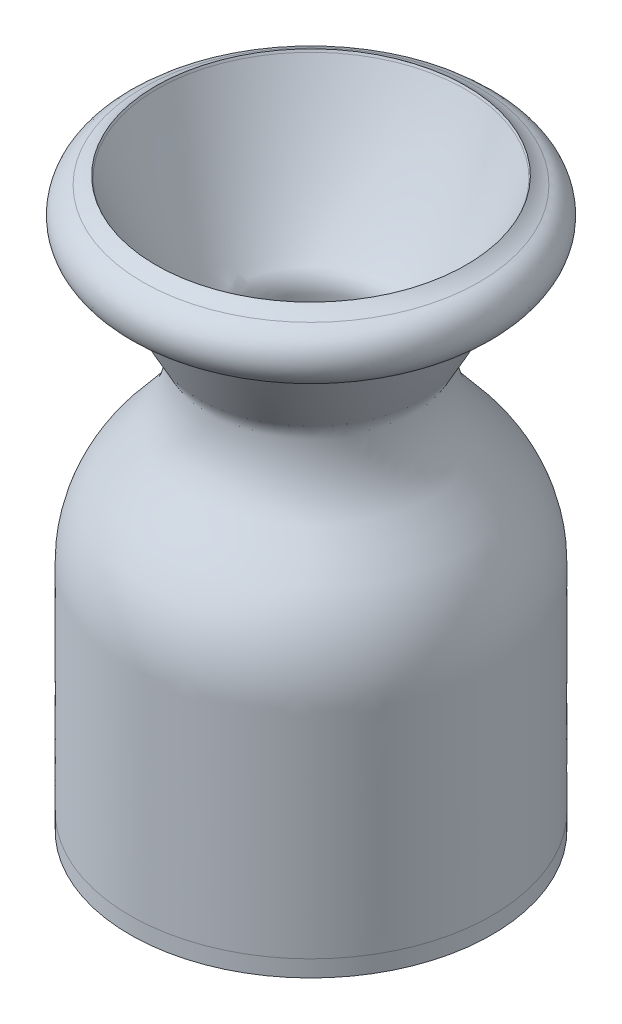
ISO-10303-21;
HEADER;
FILE_DESCRIPTION(('STEP AP214'),'2;1');
FILE_NAME('part.step','',(''),(''),'','','');
FILE_SCHEMA(('AUTOMOTIVE_DESIGN { 1 0 10303 214 1 1 1 1 }'));
ENDSEC;
DATA;
#1=APPLICATION_CONTEXT('core data for automotive mechanical design processes');
#2=APPLICATION_PROTOCOL_DEFINITION('international standard','automotive_design',2000,#1);
#3=PRODUCT_CONTEXT('',#1,'mechanical');
#4=PRODUCT('Part','Part','',(#3));
#5=PRODUCT_RELATED_PRODUCT_CATEGORY('part','',(#4));
#6=PRODUCT_DEFINITION_FORMATION('','',#4);
#7=PRODUCT_DEFINITION_CONTEXT('part definition',#1,'design');
#8=PRODUCT_DEFINITION('design','',#6,#7);
#9=PRODUCT_DEFINITION_SHAPE('','',#8);
#10=(LENGTH_UNIT() NAMED_UNIT(*) SI_UNIT(.MILLI.,.METRE.));
#11=(NAMED_UNIT(*) PLANE_ANGLE_UNIT() SI_UNIT($,.RADIAN.));
#12=(NAMED_UNIT(*) SI_UNIT($,.STERADIAN.) SOLID_ANGLE_UNIT());
#13=UNCERTAINTY_MEASURE_WITH_UNIT(LENGTH_MEASURE(1.E-05),#10,'distance_accuracy_value','');
#14=(GEOMETRIC_REPRESENTATION_CONTEXT(3) GLOBAL_UNCERTAINTY_ASSIGNED_CONTEXT((#13)) GLOBAL_UNIT_ASSIGNED_CONTEXT((#10,
#11,#12)) REPRESENTATION_CONTEXT('',''));
#15=CARTESIAN_POINT('',(0.,0.,0.));
#16=DIRECTION('',(0.,0.,1.));
#17=DIRECTION('',(1.,0.,0.));
#18=AXIS2_PLACEMENT_3D('',#15,#16,#17);
#19=CARTESIAN_POINT('',(50.9540256,50.0719934169924,0.));
#20=CARTESIAN_POINT('',(50.8738193821349,49.8818998530482,0.));
#21=CARTESIAN_POINT('',(50.7120138052918,49.4993144948154,0.));
#22=CARTESIAN_POINT('',(50.4789540390651,48.9508867116845,0.));
#23=CARTESIAN_POINT('',(50.2506142439915,48.4159986255779,0.));
#24=CARTESIAN_POINT('',(50.044150217136,47.9344658151444,0.));
#25=CARTESIAN_POINT('',(49.3842759121914,46.4016884581265,0.));
#26=CARTESIAN_POINT('',(47.3876765789822,41.84487520154,0.));
#27=CARTESIAN_POINT('',(44.1209233099269,34.8210054722971,0.));
#28=CARTESIAN_POINT('',(37.7854107549693,22.4701694837648,0.));
#29=CARTESIAN_POINT('',(32.2207284512482,13.3281532863744,0.));
#30=CARTESIAN_POINT('',(27.4262534710435,7.18297191555727,0.));
#31=CARTESIAN_POINT('',(27.1969511244329,6.89230365972697,0.));
#32=CARTESIAN_POINT('',(27.103732732,6.77471332009609,0.));
#33=CARTESIAN_POINT('',(27.0371514161743,6.69073205099653,0.));
#34=CARTESIAN_POINT('',(26.988434470706,6.63001793101766,0.));
#35=CARTESIAN_POINT('',(26.9314045443009,6.55707646096512,0.));
#36=CARTESIAN_POINT('',(26.8625865762423,6.48436650842093,0.));
#37=CARTESIAN_POINT('',(26.7602790552846,6.38011774683606,0.));
#38=CARTESIAN_POINT('',(26.6397582483279,6.25157770115886,0.));
#39=CARTESIAN_POINT('',(26.5094999061689,6.10640145949276,0.));
#40=CARTESIAN_POINT('',(26.3661713920925,5.93977114418554,0.));
#41=CARTESIAN_POINT('',(26.2325942187178,5.77656520229244,0.));
#42=CARTESIAN_POINT('',(26.0860928909707,5.58863093647015,0.));
#43=CARTESIAN_POINT('',(25.9597265085965,5.41780426961316,0.));
#44=CARTESIAN_POINT('',(25.1377251859036,4.25012944705032,0.));
#45=CARTESIAN_POINT('',(24.4117714336777,2.50188870038765,0.));
#46=CARTESIAN_POINT('',(24.2199540648207,0.704718903503931,0.));
#47=CARTESIAN_POINT('',(24.2088185868156,0.154947107718543,0.));
#48=CARTESIAN_POINT('',(24.2078738217848,0.0796893848929606,0.));
#49=CARTESIAN_POINT('',(24.2076183801961,0.0428880918571611,0.));
#50=CARTESIAN_POINT('',(24.207540141244,0.0277303754537935,0.));
#51=CARTESIAN_POINT('',(24.2074818692372,0.0106242121505248,0.));
#52=CARTESIAN_POINT('',(24.2074902582142,-0.00725420074384278,0.));
#53=CARTESIAN_POINT('',(24.2074998469084,-0.0235777743162804,0.));
#54=CARTESIAN_POINT('',(24.2075212773095,-0.0418469142828693,0.));
#55=CARTESIAN_POINT('',(24.2078902570095,-0.22027070698574,0.));
#56=CARTESIAN_POINT('',(24.2123022536967,-0.777357826144679,0.));
#57=CARTESIAN_POINT('',(24.2611954527787,-2.32186937868895,0.));
#58=CARTESIAN_POINT('',(24.9056376247705,-9.7482210765677,0.));
#59=CARTESIAN_POINT('',(27.7748425963947,-16.756085977486,0.));
#60=CARTESIAN_POINT('',(31.4777109638204,-21.7746124774382,0.));
#61=CARTESIAN_POINT('',(32.2713143326288,-22.8428224197449,0.));
#62=CARTESIAN_POINT('',(33.2277886061289,-23.9904014077415,0.));
#63=CARTESIAN_POINT('',(34.2661388410161,-25.0870928999793,0.));
#64=CARTESIAN_POINT('',(34.50212261117,-25.3312056785185,0.));
#65=CARTESIAN_POINT('',(34.6300000282893,-25.4612322962998,0.));
#66=CARTESIAN_POINT('',(34.7019944333669,-25.534180607396,0.));
#67=CARTESIAN_POINT('',(34.7352917071467,-25.5678404708828,0.));
#68=CARTESIAN_POINT('',(34.7643991652551,-25.5971979557409,0.));
#69=CARTESIAN_POINT('',(34.7892887668227,-25.6222576955839,0.));
#70=CARTESIAN_POINT('',(34.8237489623003,-25.656875089874,0.));
#71=CARTESIAN_POINT('',(34.856167117083,-25.6892808216148,0.));
#72=CARTESIAN_POINT('',(34.8859225764975,-25.7190373866543,0.));
#73=CARTESIAN_POINT('',(34.9039893413264,-25.7371038990438,0.));
#74=CARTESIAN_POINT('',(34.9263069235488,-25.7594215399908,0.));
#75=CARTESIAN_POINT('',(35.0122994296627,-25.8454139816093,0.));
#76=CARTESIAN_POINT('',(36.8539165951198,-27.6870317568959,0.));
#77=CARTESIAN_POINT('',(39.614395548514,-30.4475092719583,0.));
#78=CARTESIAN_POINT('',(42.3244827662354,-33.1575981574696,0.));
#79=CARTESIAN_POINT('',(43.2933695795012,-34.1264841259336,0.));
#80=CARTESIAN_POINT('',(43.351062339614,-34.1841771230819,0.));
#81=CARTESIAN_POINT('',(43.3950914337115,-34.2282055911124,0.));
#82=CARTESIAN_POINT('',(43.4649440781226,-34.298060723056,0.));
#83=CARTESIAN_POINT('',(43.5515180261032,-34.3845824492278,0.));
#84=CARTESIAN_POINT('',(43.6527051847229,-34.4869335744074,0.));
#85=CARTESIAN_POINT('',(43.7360562735944,-34.5715679408436,0.));
#86=CARTESIAN_POINT('',(43.8292126722218,-34.6665561009945,0.));
#87=CARTESIAN_POINT('',(44.9284831056235,-35.7981610461728,0.));
#88=CARTESIAN_POINT('',(48.1709125541368,-39.5945375402875,0.));
#89=CARTESIAN_POINT('',(50.8481585963388,-44.4615047057487,0.));
#90=CARTESIAN_POINT('',(53.3684596914908,-51.6335852842184,0.));
#91=CARTESIAN_POINT('',(54.0866538604265,-55.8983000121118,0.));
#92=CARTESIAN_POINT('',(54.1277999007181,-59.6425278857776,0.));
#93=CARTESIAN_POINT('',(54.1288868953179,-59.7891007878411,0.));
#94=CARTESIAN_POINT('',(54.1293644989873,-59.8827138083625,0.));
#95=CARTESIAN_POINT('',(54.1296175336492,-59.9613889027057,0.));
#96=CARTESIAN_POINT('',(54.1296089246992,-60.0251424194379,0.));
#97=CARTESIAN_POINT('',(54.1296099112297,-60.0807740192387,0.));
#98=CARTESIAN_POINT('',(54.1296097354104,-60.1241971417937,0.));
#99=CARTESIAN_POINT('',(54.1296098287224,-60.1906887968843,0.));
#100=CARTESIAN_POINT('',(54.1296093796806,-61.3575621863361,0.));
#101=CARTESIAN_POINT('',(54.1296099388634,-63.3448242972139,0.));
#102=CARTESIAN_POINT('',(54.1296097815121,-65.6864178791786,0.));
#103=CARTESIAN_POINT('',(54.1296098835102,-78.2730305006684,0.));
#104=CARTESIAN_POINT('',(54.1296097597558,-99.1505714779354,0.));
#105=CARTESIAN_POINT('',(54.1296097946941,-119.943778540802,0.));
#106=CARTESIAN_POINT('',(54.1296097944564,-129.533368434241,0.));
#107=CARTESIAN_POINT('',(54.1296097944596,-130.317544837977,0.));
#108=CARTESIAN_POINT('',(54.1296097944578,-130.796442406361,0.));
#109=CARTESIAN_POINT('',(54.1296097944585,-131.122700640651,0.));
#110=B_SPLINE_CURVE_WITH_KNOTS('',3,(#19,#20,#21,#22,#23,#24,#25,#26,#27,#28,#29,#30,#31,#32,
#33,#34,#35,#36,#37,#38,#39,#40,#41,#42,#43,#44,#45,#46,#47,#48,#49,#50,#51,#52,#53,#54,#55,#56,
#57,#58,#59,#60,#61,#62,#63,#64,#65,#66,#67,#68,#69,#70,#71,#72,#73,#74,#75,#76,#77,#78,#79,#80,
#81,#82,#83,#84,#85,#86,#87,#88,#89,#90,#91,#92,#93,#94,#95,#96,#97,#98,#99,#100,#101,#102,#103,
#104,#105,#106,#107,#108,#109),.UNSPECIFIED.,.F.,.F.,(4,1,1,1,1,1,1,1,1,1,1,1,1,1,1,1,1,1,1,1,1,
1,1,1,1,1,1,1,1,1,1,1,1,1,1,1,1,1,1,1,1,1,1,1,1,1,1,1,1,1,1,1,1,1,1,1,1,1,1,1,1,1,1,1,1,1,1,1,1,
1,1,1,1,1,1,1,1,1,1,1,1,1,1,1,1,1,1,1,4),(0.,0.00314141791795483,0.00632472549959207,
0.00907298072128143,0.0119965717642745,0.0143019764586679,0.0344815578545249,0.0877473518529712,
0.132192235222059,0.245910224670777,0.249708307478521,0.250864578496316,0.251547212474774,
0.251993069869887,0.252496328145167,0.252732544291328,0.253402437844663,0.254018238150379,
0.254957236756751,0.256084674239469,0.256987848201517,0.25830354848683,0.259295324264542,
0.260615863009407,0.261538003236786,0.281042936116073,0.288357700643986,0.288990745393485,
0.289414954054674,0.289503650889057,0.289551088321565,0.289645746006047,0.289764107472503,
0.289823301703394,0.28989428609997,0.29004227054226,0.292539955608698,0.298376836772543,
0.313559996273239,0.406150364208937,0.406243228387235,0.407329968744184,0.4261641534013,
0.428796691756144,0.430333463706484,0.431333282179851,0.43157349129068,0.431893990876249,
0.43205417269877,0.432202947455138,0.432431763058074,0.432797883512648,0.432900859748498,
0.433072486803854,0.433186904839193,0.433381415500945,0.43492412659905,0.472841679830158,
0.492821632970943,0.493279313804503,0.49370430314491,0.494063909512703,0.494227366951706,
0.495208437918936,0.495927500173626,0.496418747504521,0.497017070885715,0.497953212932418,
0.520439309703328,0.572904779995986,0.581048474359325,0.636246968490097,0.637342272480401,
0.638065533378638,0.638478680788448,0.638767631509687,0.639263431377761,0.639449380717532,
0.639614669019551,0.639924584585836,0.640461771567397,0.657381288501652,0.670182305894797,
0.676114484686742,0.849022951903642,0.988060260980177,0.992708385345934,0.995032447528813,1.),.UNSPECIFIED.);
#111=CARTESIAN_POINT('',(3.45223679334034E-11,-0.163355664586275,0.));
#112=DIRECTION('',(0.,1.,0.));
#113=AXIS1_PLACEMENT('',#111,#112);
#114=SURFACE_OF_REVOLUTION('',#110,#113);
#115=CARTESIAN_POINT('',(3.45384058276677E-11,-131.122700640651,0.));
#116=DIRECTION('',(0.,1.,0.));
#117=DIRECTION('',(-1.,0.,0.));
#118=AXIS2_PLACEMENT_3D('',#115,#116,#117);
#119=CIRCLE('',#118,54.1296097944239);
#120=CARTESIAN_POINT('',(-54.1296097943894,-131.122700640651,0.));
#121=VERTEX_POINT('',#120);
#122=EDGE_CURVE('E10',#121,#121,#119,.T.);
#123=ORIENTED_EDGE('',*,*,#122,.F.);
#124=EDGE_LOOP('',(#123));
#125=FACE_BOUND('',#124,.T.);
#126=CARTESIAN_POINT('',(3.45162158774577E-11,50.0719934169924,0.));
#127=DIRECTION('',(0.,1.,0.));
#128=DIRECTION('',(-1.,0.,0.));
#129=AXIS2_PLACEMENT_3D('',#126,#127,#128);
#130=CIRCLE('',#129,50.9540255999655);
#131=CARTESIAN_POINT('',(-50.954025599931,50.0719934169924,0.));
#132=VERTEX_POINT('',#131);
#133=EDGE_CURVE('E83',#132,#132,#130,.T.);
#134=ORIENTED_EDGE('',*,*,#133,.T.);
#135=EDGE_LOOP('',(#134));
#136=FACE_BOUND('',#135,.T.);
#137=ADVANCED_FACE('F32',(#125,#136),#114,.T.);
#138=CARTESIAN_POINT('',(54.1296097944585,-131.122700640651,0.));
#139=DIRECTION('',(0.,-1.,0.));
#140=DIRECTION('',(1.,0.,0.));
#141=AXIS2_PLACEMENT_3D('',#138,#139,#140);
#142=PLANE('',#141);
#143=ORIENTED_EDGE('',*,*,#122,.T.);
#144=EDGE_LOOP('',(#143));
#145=FACE_BOUND('',#144,.T.);
#146=ADVANCED_FACE('F116',(#145),#142,.F.);
#147=CARTESIAN_POINT('',(3.45390758515259E-11,-136.593860640651,0.));
#148=DIRECTION('',(0.,1.,0.));
#149=DIRECTION('',(-1.,0.,0.));
#150=AXIS2_PLACEMENT_3D('',#147,#148,#149);
#151=PLANE('',#150);
#152=CARTESIAN_POINT('',(3.45390758515259E-11,-136.593860640651,0.));
#153=DIRECTION('',(0.,1.,0.));
#154=DIRECTION('',(-1.,0.,0.));
#155=AXIS2_PLACEMENT_3D('',#152,#153,#154);
#156=CIRCLE('',#155,59.8203149840166);
#157=CARTESIAN_POINT('',(-59.820314983982,-136.593860640651,0.));
#158=VERTEX_POINT('',#157);
#159=EDGE_CURVE('E68',#158,#158,#156,.T.);
#160=ORIENTED_EDGE('',*,*,#159,.F.);
#161=EDGE_LOOP('',(#160));
#162=FACE_BOUND('',#161,.T.);
#163=ADVANCED_FACE('F112',(#162),#151,.F.);
#164=CARTESIAN_POINT('',(3.45223679334034E-11,-0.163355664586275,0.));
#165=DIRECTION('',(0.,1.,0.));
#166=DIRECTION('',(-1.,0.,0.));
#167=AXIS2_PLACEMENT_3D('',#164,#165,#166);
#168=CYLINDRICAL_SURFACE('',#167,59.8203149840166);
#169=CARTESIAN_POINT('',(3.45384058155058E-11,-131.122601330851,0.));
#170=DIRECTION('',(0.,1.,0.));
#171=DIRECTION('',(-1.,0.,0.));
#172=AXIS2_PLACEMENT_3D('',#169,#170,#171);
#173=CIRCLE('',#172,59.8203149840166);
#174=CARTESIAN_POINT('',(-59.820314983982,-131.122601330851,0.));
#175=VERTEX_POINT('',#174);
#176=EDGE_CURVE('E71',#175,#175,#173,.T.);
#177=ORIENTED_EDGE('',*,*,#176,.F.);
#178=EDGE_LOOP('',(#177));
#179=FACE_BOUND('',#178,.T.);
#180=ORIENTED_EDGE('',*,*,#159,.T.);
#181=EDGE_LOOP('',(#180));
#182=FACE_BOUND('',#181,.T.);
#183=ADVANCED_FACE('F108',(#179,#182),#168,.T.);
#184=CARTESIAN_POINT('',(59.8203149840511,-131.122601330851,0.));
#185=CARTESIAN_POINT('',(59.8203149840511,-130.936295711517,0.));
#186=CARTESIAN_POINT('',(59.8203149842328,-130.323608926654,0.));
#187=CARTESIAN_POINT('',(59.8203149771781,-126.059298686732,0.));
#188=CARTESIAN_POINT('',(59.8203156056872,-106.913767020634,0.));
#189=CARTESIAN_POINT('',(59.8203085850822,-84.5367962256082,0.));
#190=CARTESIAN_POINT('',(59.8203182259624,-65.6068957112712,0.));
#191=CARTESIAN_POINT('',(59.8203144741451,-61.591107674748,0.));
#192=CARTESIAN_POINT('',(59.8203162600623,-61.1256424278742,0.));
#193=CARTESIAN_POINT('',(59.8203118044041,-60.7622587609203,0.));
#194=CARTESIAN_POINT('',(59.8203247604757,-60.4844269976953,0.));
#195=CARTESIAN_POINT('',(59.8202811198641,-60.1685058577555,0.));
#196=CARTESIAN_POINT('',(59.8205769501629,-59.8516944636556,0.));
#197=CARTESIAN_POINT('',(59.8177096477731,-59.5391767804862,0.));
#198=CARTESIAN_POINT('',(59.8144470688254,-59.2698634661859,0.));
#199=CARTESIAN_POINT('',(59.7563423862633,-55.8953537062167,0.));
#200=CARTESIAN_POINT('',(59.2177805508791,-51.8010413003439,0.));
#201=CARTESIAN_POINT('',(57.6507984280436,-45.9376275809487,0.));
#202=CARTESIAN_POINT('',(55.2760232018322,-39.5219271362551,0.));
#203=CARTESIAN_POINT('',(52.0332176702946,-34.2537894869382,0.));
#204=CARTESIAN_POINT('',(49.445714124171,-30.9972944198057,0.));
#205=CARTESIAN_POINT('',(49.2469193509516,-30.7497204331146,0.));
#206=CARTESIAN_POINT('',(49.0070343250879,-30.4568615064501,0.));
#207=CARTESIAN_POINT('',(48.7341834419592,-30.1298128832694,0.));
#208=CARTESIAN_POINT('',(48.378058129756,-29.7097980507631,0.));
#209=CARTESIAN_POINT('',(48.0143056070963,-29.2850053157462,0.));
#210=CARTESIAN_POINT('',(47.6963965555428,-28.9098709808958,0.));
#211=CARTESIAN_POINT('',(47.3227046652023,-28.4691155173863,0.));
#212=CARTESIAN_POINT('',(46.7786256679771,-27.8239993291357,0.));
#213=CARTESIAN_POINT('',(44.857976090298,-25.5374361331822,0.));
#214=CARTESIAN_POINT('',(43.0882712200282,-23.3830871394598,0.));
#215=CARTESIAN_POINT('',(41.4376784978971,-21.3232062743922,0.));
#216=CARTESIAN_POINT('',(41.1380380652142,-20.9474351179314,0.));
#217=CARTESIAN_POINT('',(40.8858048672182,-20.6302047336732,0.));
#218=CARTESIAN_POINT('',(40.7309154491541,-20.4346730698027,0.));
#219=CARTESIAN_POINT('',(40.5498877936497,-20.2068480011569,0.));
#220=CARTESIAN_POINT('',(40.3442227685049,-19.9417710545852,0.));
#221=CARTESIAN_POINT('',(40.1214870647666,-19.6391476992203,0.));
#222=CARTESIAN_POINT('',(39.8907607759131,-19.3204160043036,0.));
#223=CARTESIAN_POINT('',(39.6213711554245,-18.9323234089007,0.));
#224=CARTESIAN_POINT('',(37.5570232310499,-15.8631286065341,0.));
#225=CARTESIAN_POINT('',(35.8823064921145,-11.933514002313,0.));
#226=CARTESIAN_POINT('',(34.4950295322923,-5.90582217322312,0.));
#227=CARTESIAN_POINT('',(34.1801808778814,-2.99056727828635,0.));
#228=CARTESIAN_POINT('',(34.1353778442653,-0.657288023783938,0.));
#229=CARTESIAN_POINT('',(34.1330016957644,-0.468244283063395,0.));
#230=CARTESIAN_POINT('',(34.1311965377999,-0.313707323278597,0.));
#231=CARTESIAN_POINT('',(34.131169776004,-0.156011067221766,0.));
#232=CARTESIAN_POINT('',(34.1203044186186,0.163552258691088,0.));
#233=CARTESIAN_POINT('',(34.2358410489707,0.511180090554679,0.));
#234=CARTESIAN_POINT('',(34.5409025293757,1.00544192027647,0.));
#235=CARTESIAN_POINT('',(34.8183052029947,1.49423807434364,0.));
#236=CARTESIAN_POINT('',(35.3751673515945,2.44870917638519,0.));
#237=CARTESIAN_POINT('',(35.8830030134443,3.33896251051106,0.));
#238=CARTESIAN_POINT('',(37.7602593957516,6.65157410563165,0.));
#239=CARTESIAN_POINT('',(42.5764327952609,15.5727319267239,0.));
#240=CARTESIAN_POINT('',(46.8205580038166,24.6177069839374,0.));
#241=CARTESIAN_POINT('',(49.6230216568757,31.0600508582028,0.));
#242=CARTESIAN_POINT('',(49.6747840609487,31.1791510835269,0.));
#243=CARTESIAN_POINT('',(49.7053411850459,31.2495219071284,0.));
#244=CARTESIAN_POINT('',(49.7252391966176,31.2953723822775,0.));
#245=B_SPLINE_CURVE_WITH_KNOTS('',3,(#184,#185,#186,#187,#188,#189,#190,#191,#192,#193,#194,
#195,#196,#197,#198,#199,#200,#201,#202,#203,#204,#205,#206,#207,#208,#209,#210,#211,#212,#213,
#214,#215,#216,#217,#218,#219,#220,#221,#222,#223,#224,#225,#226,#227,#228,#229,#230,#231,#232,
#233,#234,#235,#236,#237,#238,#239,#240,#241,#242,#243,#244),.UNSPECIFIED.,.F.,.F.,(4,1,1,1,1,1,
1,1,1,1,1,1,1,1,1,1,1,1,1,1,1,1,1,1,1,1,1,1,1,1,1,1,1,1,1,1,1,1,1,1,1,1,1,1,1,1,1,1,1,1,1,1,1,1,
1,1,1,1,4),(0.,0.00323108695515351,0.0106257894161662,0.0739556715372836,0.33527087088865,
0.398708226060531,0.402255775663599,0.4049164378659,0.406780760968657,0.408557917320614,
0.409734854346742,0.412259771352629,0.414052294309559,0.415155027389706,0.416930745375169,
0.472588092010404,0.486015121854949,0.522187929915599,0.590901745859957,0.591902495929721,
0.594325171577334,0.596408129049772,0.598467844796782,0.601711805530003,0.60595829263387,
0.608166929190702,0.610239721388489,0.615979918555319,0.622802901281019,0.662028993160284,
0.664327497967758,0.668581598482338,0.670364210286054,0.671356350342906,0.672907716655566,
0.675410893634778,0.677174339156569,0.679424161155354,0.682234846382799,0.685366691679169,
0.743582564872944,0.754491327389895,0.792703951295036,0.794043677770068,0.79496669274384,
0.795982786924676,0.796723816709478,0.797702021188108,0.801521623455512,0.802790364532893,
0.807797758448746,0.811254984068005,0.821959773691282,0.825569995082923,0.877290157630856,
0.997747807336152,0.998669468379309,0.999133165931464,1.),.UNSPECIFIED.);
#246=CARTESIAN_POINT('',(3.45223679334034E-11,-0.163355664586275,0.));
#247=DIRECTION('',(0.,1.,0.));
#248=AXIS1_PLACEMENT('',#246,#247);
#249=SURFACE_OF_REVOLUTION('',#245,#248);
#250=CARTESIAN_POINT('',(3.45185153503426E-11,31.2953723822775,0.));
#251=DIRECTION('',(0.,1.,0.));
#252=DIRECTION('',(-1.,0.,0.));
#253=AXIS2_PLACEMENT_3D('',#250,#251,#252);
#254=CIRCLE('',#253,49.7252391965831);
#255=CARTESIAN_POINT('',(-49.7252391965486,31.2953723822775,0.));
#256=VERTEX_POINT('',#255);
#257=EDGE_CURVE('E74',#256,#256,#254,.T.);
#258=ORIENTED_EDGE('',*,*,#257,.F.);
#259=EDGE_LOOP('',(#258));
#260=FACE_BOUND('',#259,.T.);
#261=ORIENTED_EDGE('',*,*,#176,.T.);
#262=EDGE_LOOP('',(#261));
#263=FACE_BOUND('',#262,.T.);
#264=ADVANCED_FACE('F103',(#260,#263),#249,.T.);
#265=CARTESIAN_POINT('',(49.7252391966176,31.2953723822775,0.));
#266=CARTESIAN_POINT('',(49.7828633290722,31.2726694559346,0.));
#267=CARTESIAN_POINT('',(50.0713392868115,31.1624837009409,0.));
#268=CARTESIAN_POINT('',(50.8219621215119,30.9197221771198,0.));
#269=CARTESIAN_POINT('',(52.0288021904083,30.6873370727797,0.));
#270=CARTESIAN_POINT('',(53.5574982967202,30.6490306409971,0.));
#271=CARTESIAN_POINT('',(55.5816020347392,30.9560697829107,0.));
#272=CARTESIAN_POINT('',(57.9143440964855,31.9730734500117,0.));
#273=CARTESIAN_POINT('',(59.7975077412506,33.7006568919434,0.));
#274=CARTESIAN_POINT('',(61.0995333884969,35.7292441111342,0.));
#275=CARTESIAN_POINT('',(62.3920583016332,39.4201907562103,0.));
#276=CARTESIAN_POINT('',(61.3904635016306,43.4693008840625,0.));
#277=CARTESIAN_POINT('',(59.3815709250251,45.7619608043767,0.));
#278=CARTESIAN_POINT('',(58.7449288211698,46.3553303201213,0.));
#279=CARTESIAN_POINT('',(58.1632003536053,46.8009335348128,0.));
#280=CARTESIAN_POINT('',(57.7073656711799,47.1025019388313,0.));
#281=CARTESIAN_POINT('',(57.3512376265524,47.3128504798267,0.));
#282=CARTESIAN_POINT('',(57.0546581912247,47.4717403942926,0.));
#283=CARTESIAN_POINT('',(56.488224292858,47.7512197532841,0.));
#284=CARTESIAN_POINT('',(56.0014952680152,47.9368110603449,0.));
#285=CARTESIAN_POINT('',(55.6078854247711,48.1083911050935,0.));
#286=B_SPLINE_CURVE_WITH_KNOTS('',3,(#265,#266,#267,#268,#269,#270,#271,#272,#273,#274,#275,
#276,#277,#278,#279,#280,#281,#282,#283,#284,#285),.UNSPECIFIED.,.F.,.F.,(4,1,1,1,1,1,1,1,1,1,1,
1,1,1,1,1,1,1,4),(0.,0.006553470254411,0.0326740594591735,0.083384731010278,0.135995329690488,
0.193713922589779,0.298935334644577,0.399896447705168,0.45922540350862,0.552611234620452,
0.809397417045734,0.841490970863733,0.875379590723661,0.901243355546554,0.918950553086676,
0.933181711555501,0.944993255559003,0.954544897154395,1.),.UNSPECIFIED.);
#287=CARTESIAN_POINT('',(3.45223679334034E-11,-0.163355664586275,0.));
#288=DIRECTION('',(0.,1.,0.));
#289=AXIS1_PLACEMENT('',#287,#288);
#290=SURFACE_OF_REVOLUTION('',#286,#289);
#291=CARTESIAN_POINT('',(3.45164563493863E-11,48.1083911050935,0.));
#292=DIRECTION('',(0.,1.,0.));
#293=DIRECTION('',(-1.,0.,0.));
#294=AXIS2_PLACEMENT_3D('',#291,#292,#293);
#295=CIRCLE('',#294,55.6078854247366);
#296=CARTESIAN_POINT('',(-55.6078854247021,48.1083911050935,0.));
#297=VERTEX_POINT('',#296);
#298=EDGE_CURVE('E77',#297,#297,#295,.T.);
#299=ORIENTED_EDGE('',*,*,#298,.F.);
#300=EDGE_LOOP('',(#299));
#301=FACE_BOUND('',#300,.T.);
#302=ORIENTED_EDGE('',*,*,#257,.T.);
#303=EDGE_LOOP('',(#302));
#304=FACE_BOUND('',#303,.T.);
#305=ADVANCED_FACE('F98',(#301,#304),#290,.T.);
#306=CARTESIAN_POINT('',(3.45140582780346E-11,62.7664819505126,0.));
#307=DIRECTION('',(0.,1.,0.));
#308=DIRECTION('',(-1.,0.,0.));
#309=AXIS2_PLACEMENT_3D('',#306,#307,#308);
#310=TOROIDAL_SURFACE('',#309,61.7925713260438,15.9094301258841);
#311=CARTESIAN_POINT('',(3.45161229994291E-11,50.8304000743659,0.));
#312=DIRECTION('',(0.,1.,0.));
#313=DIRECTION('',(-1.,0.,0.));
#314=AXIS2_PLACEMENT_3D('',#311,#312,#313);
#315=CIRCLE('',#314,51.2740202672567);
#316=CARTESIAN_POINT('',(-51.2740202672221,50.8304000743659,0.));
#317=VERTEX_POINT('',#316);
#318=EDGE_CURVE('E80',#317,#317,#315,.T.);
#319=ORIENTED_EDGE('',*,*,#318,.F.);
#320=EDGE_LOOP('',(#319));
#321=FACE_BOUND('',#320,.T.);
#322=ORIENTED_EDGE('',*,*,#298,.T.);
#323=EDGE_LOOP('',(#322));
#324=FACE_BOUND('',#323,.T.);
#325=ADVANCED_FACE('F102',(#321,#324),#310,.F.);
#326=CARTESIAN_POINT('',(3.45161229994291E-11,50.8304000743659,0.));
#327=DIRECTION('',(0.,1.,0.));
#328=DIRECTION('',(-1.,0.,0.));
#329=AXIS2_PLACEMENT_3D('',#326,#327,#328);
#330=CONICAL_SURFACE('',#329,51.2740202672567,0.399267622614394);
#331=ORIENTED_EDGE('',*,*,#133,.F.);
#332=EDGE_LOOP('',(#331));
#333=FACE_BOUND('',#332,.T.);
#334=ORIENTED_EDGE('',*,*,#318,.T.);
#335=EDGE_LOOP('',(#334));
#336=FACE_BOUND('',#335,.T.);
#337=ADVANCED_FACE('F192',(#333,#336),#330,.F.);
#338=CLOSED_SHELL('',(#137,#146,#163,#183,#264,#305,#325,#337));
#339=CARTESIAN_POINT('',(54.5811201944008,-132.021860640651,0.));
#340=DIRECTION('',(0.,1.,0.));
#341=DIRECTION('',(-1.,0.,0.));
#342=AXIS2_PLACEMENT_3D('',#339,#340,#341);
#343=PLANE('',#342);
#344=CARTESIAN_POINT('',(3.45385159430093E-11,-132.021860640651,0.));
#345=DIRECTION('',(0.,1.,0.));
#346=DIRECTION('',(-1.,0.,0.));
#347=AXIS2_PLACEMENT_3D('',#344,#345,#346);
#348=CIRCLE('',#347,54.5811201943663);
#349=CARTESIAN_POINT('',(-54.5811201943317,-132.021860640651,0.));
#350=VERTEX_POINT('',#349);
#351=EDGE_CURVE('E40',#350,#350,#348,.T.);
#352=ORIENTED_EDGE('',*,*,#351,.F.);
#353=EDGE_LOOP('',(#352));
#354=FACE_BOUND('',#353,.T.);
#355=ADVANCED_FACE('F178',(#354),#343,.F.);
#356=CARTESIAN_POINT('',(3.45223679334034E-11,-0.163355664586275,0.));
#357=DIRECTION('',(0.,1.,0.));
#358=DIRECTION('',(-1.,0.,0.));
#359=AXIS2_PLACEMENT_3D('',#356,#357,#358);
#360=CYLINDRICAL_SURFACE('',#359,54.5811201943663);
#361=CARTESIAN_POINT('',(3.45384058267038E-11,-131.122692769674,0.));
#362=DIRECTION('',(0.,1.,0.));
#363=DIRECTION('',(-1.,0.,0.));
#364=AXIS2_PLACEMENT_3D('',#361,#362,#363);
#365=CIRCLE('',#364,54.5811201943663);
#366=CARTESIAN_POINT('',(-54.5811201943317,-131.122692769674,0.));
#367=VERTEX_POINT('',#366);
#368=EDGE_CURVE('E44',#367,#367,#365,.T.);
#369=ORIENTED_EDGE('',*,*,#368,.F.);
#370=EDGE_LOOP('',(#369));
#371=FACE_BOUND('',#370,.T.);
#372=ORIENTED_EDGE('',*,*,#351,.T.);
#373=EDGE_LOOP('',(#372));
#374=FACE_BOUND('',#373,.T.);
#375=ADVANCED_FACE('F162',(#371,#374),#360,.T.);
#376=CARTESIAN_POINT('',(54.5811201944008,-131.122692769674,0.));
#377=CARTESIAN_POINT('',(54.5811201944008,-131.060067350837,0.));
#378=CARTESIAN_POINT('',(54.5811201944009,-130.941150946912,0.));
#379=CARTESIAN_POINT('',(54.5811201944006,-130.725735711398,0.));
#380=CARTESIAN_POINT('',(54.5811201944023,-130.433558693541,0.));
#381=CARTESIAN_POINT('',(54.5811201943232,-127.468329682279,0.));
#382=CARTESIAN_POINT('',(54.5811202193823,-107.003869003228,0.));
#383=CARTESIAN_POINT('',(54.5811198309568,-84.5087170014834,0.));
#384=CARTESIAN_POINT('',(54.5811202972493,-64.1821133407062,0.));
#385=CARTESIAN_POINT('',(54.5811201359793,-61.4068358840544,0.));
#386=CARTESIAN_POINT('',(54.5811202091571,-60.7538169362031,0.));
#387=CARTESIAN_POINT('',(54.5811201268725,-60.6069411708795,0.));
#388=CARTESIAN_POINT('',(54.581120463845,-60.4600654012809,0.));
#389=CARTESIAN_POINT('',(54.58111947521,-60.3268525071676,0.));
#390=CARTESIAN_POINT('',(54.5811221856382,-60.2151458486794,0.));
#391=CARTESIAN_POINT('',(54.5811091271974,-60.0732344362947,0.));
#392=CARTESIAN_POINT('',(54.5812011435047,-59.9246420361387,0.));
#393=CARTESIAN_POINT('',(54.5800526739235,-59.7493867018545,0.));
#394=CARTESIAN_POINT('',(54.5772508166961,-59.4529234678808,0.));
#395=CARTESIAN_POINT('',(54.5643679644511,-58.7037176998263,0.));
#396=CARTESIAN_POINT('',(54.4976715872192,-57.3290692372791,0.));
#397=CARTESIAN_POINT('',(54.0609201143804,-52.7541109837499,0.));
#398=CARTESIAN_POINT('',(52.3008524738795,-46.2223163757409,0.));
#399=CARTESIAN_POINT('',(48.7884894672385,-39.9189665917695,0.));
#400=CARTESIAN_POINT('',(45.9641966290704,-36.2868099763541,0.));
#401=CARTESIAN_POINT('',(44.5733613109508,-34.7768684901345,0.));
#402=CARTESIAN_POINT('',(43.9551186616808,-34.1506426890312,0.));
#403=CARTESIAN_POINT('',(43.9170820657085,-34.1121877358921,0.));
#404=CARTESIAN_POINT('',(43.8827621149096,-34.0775873430341,0.));
#405=CARTESIAN_POINT('',(43.8575877543119,-34.0522756025941,0.));
#406=CARTESIAN_POINT('',(43.8402747317742,-34.0348973087544,0.));
#407=CARTESIAN_POINT('',(43.8207532690047,-34.0153408190956,0.));
#408=CARTESIAN_POINT('',(43.7990373254237,-33.9935895817265,0.));
#409=CARTESIAN_POINT('',(43.7676798245084,-33.962241905814,0.));
#410=CARTESIAN_POINT('',(43.73384785879,-33.9284055123834,0.));
#411=CARTESIAN_POINT('',(43.6859356652518,-33.8804946787081,0.));
#412=CARTESIAN_POINT('',(43.5769697004151,-33.7715277702821,0.));
#413=CARTESIAN_POINT('',(41.8209142768052,-32.015477937739,0.));
#414=CARTESIAN_POINT('',(39.9810576102159,-30.175616089865,0.));
#415=CARTESIAN_POINT('',(37.3184101285823,-27.5129687836994,0.));
#416=CARTESIAN_POINT('',(36.2962031437968,-26.4907616051754,0.));
#417=CARTESIAN_POINT('',(35.3645953751379,-25.5591539831354,0.));
#418=CARTESIAN_POINT('',(35.3161612800354,-25.5107198562385,0.));
#419=CARTESIAN_POINT('',(35.2709560500583,-25.4655147507323,0.));
#420=CARTESIAN_POINT('',(35.2325024935212,-25.4270608024048,0.));
#421=CARTESIAN_POINT('',(35.1692697659671,-25.363829672827,0.));
#422=CARTESIAN_POINT('',(35.1085753334262,-25.3031113571475,0.));
#423=CARTESIAN_POINT('',(35.0232477681135,-25.2169450418848,0.));
#424=CARTESIAN_POINT('',(34.9507699347564,-25.1434740101965,0.));
#425=CARTESIAN_POINT('',(34.7557336894246,-24.9448699197295,0.));
#426=CARTESIAN_POINT('',(34.1100554721511,-24.2719943112558,0.));
#427=CARTESIAN_POINT('',(30.8547114068788,-20.6251005358745,0.));
#428=CARTESIAN_POINT('',(27.1770990125199,-14.3604896490842,0.));
#429=CARTESIAN_POINT('',(25.1353824835063,-6.73362464346613,0.));
#430=CARTESIAN_POINT('',(24.7005927444762,-2.43800340572557,0.));
#431=CARTESIAN_POINT('',(24.6604965409516,-0.528930625555054,0.));
#432=CARTESIAN_POINT('',(24.6590750752015,-0.062506230459565,0.));
#433=CARTESIAN_POINT('',(24.6590317850127,-0.0418469153864163,0.));
#434=CARTESIAN_POINT('',(24.6590032525925,-0.0158040586429905,0.));
#435=CARTESIAN_POINT('',(24.6589803148081,0.00673648186333714,0.));
#436=CARTESIAN_POINT('',(24.6590530262121,0.027730380987001,0.));
#437=CARTESIAN_POINT('',(24.6591707532698,0.0494313924755953,0.));
#438=CARTESIAN_POINT('',(24.659377241557,0.0736712072911272,0.));
#439=CARTESIAN_POINT('',(24.6599986347108,0.126149502004701,0.));
#440=CARTESIAN_POINT('',(24.6615022814729,0.215451195982781,0.));
#441=CARTESIAN_POINT('',(24.6665523657317,0.392202692815358,0.));
#442=CARTESIAN_POINT('',(24.7220652859506,1.36354511689924,0.));
#443=CARTESIAN_POINT('',(24.9697366945576,2.51097473915286,0.));
#444=CARTESIAN_POINT('',(25.4544765451177,3.67428900899558,0.));
#445=CARTESIAN_POINT('',(25.723318032679,4.20611084880525,0.));
#446=CARTESIAN_POINT('',(26.000230950815,4.67808898048746,0.));
#447=CARTESIAN_POINT('',(26.4233238002519,5.31082305917643,0.));
#448=CARTESIAN_POINT('',(26.8192890250765,5.7904105168983,0.));
#449=CARTESIAN_POINT('',(27.1330236605094,6.11545566825801,0.));
#450=CARTESIAN_POINT('',(27.1685089710862,6.15204626371531,0.));
#451=CARTESIAN_POINT('',(27.2224294155344,6.20644004653763,0.));
#452=CARTESIAN_POINT('',(27.2737428802458,6.26257177009527,0.));
#453=CARTESIAN_POINT('',(27.3223220684965,6.32429531568921,0.));
#454=CARTESIAN_POINT('',(27.4848236695854,6.5277781450316,0.));
#455=CARTESIAN_POINT('',(28.3074426335623,7.57109548890133,0.));
#456=CARTESIAN_POINT('',(38.1005108103847,20.5379769661129,0.));
#457=CARTESIAN_POINT('',(45.1222554653467,35.2084235631373,0.));
#458=CARTESIAN_POINT('',(50.9760441100125,48.9669832608041,0.));
#459=CARTESIAN_POINT('',(50.9848714710762,48.9877338693553,0.));
#460=CARTESIAN_POINT('',(50.9997377995375,49.0226853506776,0.));
#461=CARTESIAN_POINT('',(51.0106597986877,49.0483699620685,0.));
#462=CARTESIAN_POINT('',(51.0192421498425,49.0685566656947,0.));
#463=B_SPLINE_CURVE_WITH_KNOTS('',3,(#376,#377,#378,#379,#380,#381,#382,#383,#384,#385,#386,
#387,#388,#389,#390,#391,#392,#393,#394,#395,#396,#397,#398,#399,#400,#401,#402,#403,#404,#405,
#406,#407,#408,#409,#410,#411,#412,#413,#414,#415,#416,#417,#418,#419,#420,#421,#422,#423,#424,
#425,#426,#427,#428,#429,#430,#431,#432,#433,#434,#435,#436,#437,#438,#439,#440,#441,#442,#443,
#444,#445,#446,#447,#448,#449,#450,#451,#452,#453,#454,#455,#456,#457,#458,#459,#460,#461,#462),
.UNSPECIFIED.,.F.,.F.,(4,1,1,1,1,1,1,1,1,1,1,1,1,1,1,1,1,1,1,1,1,1,1,1,1,1,1,1,1,1,1,1,1,1,1,1,
1,1,1,1,1,1,1,1,1,1,1,1,1,1,1,1,1,1,1,1,1,1,1,1,1,1,1,1,1,1,1,1,1,1,1,1,1,1,1,1,1,1,1,1,1,1,1,1,
4),(0.,0.000957453794972918,0.00181806308591659,0.00329339329896294,0.00542442582891856,
0.0471522073135016,0.31616596011565,0.349343381692062,0.35791713585685,0.358596014620095,
0.359327114826666,0.36016265791989,0.360841536683135,0.3613637511164,0.361870493805397,
0.36301116285652,0.363635503732909,0.364549947385006,0.367543863239953,0.375091225372589,
0.385582594924492,0.437800661754968,0.476929161419698,0.495131782692123,0.508043358787656,
0.508286634484889,0.508585614921736,0.50887029443351,0.509031714830625,0.509131404879988,
0.509245331056877,0.509454173408468,0.509601313878982,0.509923215333327,0.510185713003565,
0.510637223981933,0.512279213395261,0.548153886591018,0.550417407443331,0.569849161407986,
0.570255351692091,0.570559994405806,0.570896370752278,0.571232747063218,0.571391415148251,
0.5722635288256,0.572545293085085,0.573245398162261,0.573841365429457,0.576800991253487,
0.587501350664099,0.648582297746789,0.685320088183235,0.707526654030032,0.714413078839755,
0.714509059729299,0.714657654064277,0.714728931001128,0.714907218416881,0.715002266249494,
0.715049899239686,0.715239000939257,0.715372870758038,0.715852272497395,0.716604499044152,
0.718075933114107,0.730729612724446,0.734234795654619,0.737337865459992,0.739831436522159,
0.742596563991944,0.748970631574812,0.749296497072291,0.74950358539737,0.749749873797849,
0.750467611521164,0.750664202845665,0.750950678844431,0.754448916468738,0.77097657783304,
0.999319879761154,0.999419312753753,0.99957328998479,0.999664639512291,1.),.UNSPECIFIED.);
#464=CARTESIAN_POINT('',(3.45223679334034E-11,-0.163355664586275,0.));
#465=DIRECTION('',(0.,1.,0.));
#466=AXIS1_PLACEMENT('',#464,#465);
#467=SURFACE_OF_REVOLUTION('',#463,#466);
#468=CARTESIAN_POINT('',(3.45163387630182E-11,49.0685566656947,0.));
#469=DIRECTION('',(0.,1.,0.));
#470=DIRECTION('',(-1.,0.,0.));
#471=AXIS2_PLACEMENT_3D('',#468,#469,#470);
#472=CIRCLE('',#471,51.019242149808);
#473=CARTESIAN_POINT('',(-51.0192421497735,49.0685566656947,0.));
#474=VERTEX_POINT('',#473);
#475=EDGE_CURVE('E48',#474,#474,#472,.T.);
#476=ORIENTED_EDGE('',*,*,#475,.F.);
#477=EDGE_LOOP('',(#476));
#478=FACE_BOUND('',#477,.T.);
#479=ORIENTED_EDGE('',*,*,#368,.T.);
#480=EDGE_LOOP('',(#479));
#481=FACE_BOUND('',#480,.T.);
#482=ADVANCED_FACE('F158',(#478,#481),#467,.T.);
#483=CARTESIAN_POINT('',(51.0192421498425,49.0685566656947,0.));
#484=CARTESIAN_POINT('',(51.9446285137519,48.6781085292374,0.));
#485=CARTESIAN_POINT('',(53.1996278018121,48.1485869565611,0.));
#486=CARTESIAN_POINT('',(54.8312877868393,47.4601408107874,0.));
#487=CARTESIAN_POINT('',(55.5525356810125,47.1558250280591,0.));
#488=CARTESIAN_POINT('',(55.964709732854,46.9819163139039,0.));
#489=CARTESIAN_POINT('',(56.0130051725591,46.9615391552776,0.));
#490=CARTESIAN_POINT('',(56.0739815482854,46.9358109538901,0.));
#491=CARTESIAN_POINT('',(56.1321371644266,46.9112762938555,0.));
#492=CARTESIAN_POINT('',(56.1983805371216,46.882471912791,0.));
#493=CARTESIAN_POINT('',(56.2490164536953,46.8599910568603,0.));
#494=CARTESIAN_POINT('',(58.5759418117105,45.8085489571249,0.));
#495=CARTESIAN_POINT('',(60.6499371912021,43.0759503670351,0.));
#496=CARTESIAN_POINT('',(60.975281229563,40.0259741203152,0.));
#497=CARTESIAN_POINT('',(60.9814128468754,39.1871030610406,0.));
#498=CARTESIAN_POINT('',(60.758902856189,36.9887500350531,0.));
#499=CARTESIAN_POINT('',(59.2049744297442,33.8832142498052,0.));
#500=CARTESIAN_POINT('',(55.6875996083863,31.7734223580811,0.));
#501=CARTESIAN_POINT('',(52.7358911088247,31.456744672836,0.));
#502=CARTESIAN_POINT('',(50.9824672910984,31.7990131859903,0.));
#503=CARTESIAN_POINT('',(50.2537894094408,32.0543322996366,0.));
#504=CARTESIAN_POINT('',(50.0823314543845,32.1211714686483,0.));
#505=B_SPLINE_CURVE_WITH_KNOTS('',3,(#483,#484,#485,#486,#487,#488,#489,#490,#491,#492,#493,
#494,#495,#496,#497,#498,#499,#500,#501,#502,#503,#504),.UNSPECIFIED.,.F.,.F.,(4,1,1,1,1,1,1,1,
1,1,1,1,1,1,1,1,1,1,1,4),(0.,0.100575645276837,0.136399627383529,0.177337020862888,
0.178964475568779,0.181196790355354,0.182586002010964,0.185591729993157,0.187517204914738,
0.189819367547611,0.191139077667594,0.443253756339133,0.469169776869425,0.498817184570452,
0.52697963939032,0.690413452928405,0.821553174583726,0.921762184088796,0.980583127828454,
0.99901404673346),.UNSPECIFIED.);
#506=CARTESIAN_POINT('',(3.45223679334034E-11,-0.163355664586275,0.));
#507=DIRECTION('',(0.,1.,0.));
#508=AXIS1_PLACEMENT('',#506,#507);
#509=SURFACE_OF_REVOLUTION('',#505,#508);
#510=CARTESIAN_POINT('',(3.45184142191218E-11,32.1211714686483,0.));
#511=DIRECTION('',(0.,1.,0.));
#512=DIRECTION('',(-1.,0.,0.));
#513=AXIS2_PLACEMENT_3D('',#510,#511,#512);
#514=CIRCLE('',#513,50.08233145435);
#515=CARTESIAN_POINT('',(-50.0823314543155,32.1211714686483,0.));
#516=VERTEX_POINT('',#515);
#517=EDGE_CURVE('E53',#516,#516,#514,.T.);
#518=ORIENTED_EDGE('',*,*,#517,.F.);
#519=EDGE_LOOP('',(#518));
#520=FACE_BOUND('',#519,.T.);
#521=ORIENTED_EDGE('',*,*,#475,.T.);
#522=EDGE_LOOP('',(#521));
#523=FACE_BOUND('',#522,.T.);
#524=ADVANCED_FACE('F154',(#520,#523),#509,.T.);
#525=CARTESIAN_POINT('',(50.0823314543845,32.1211714686483,0.));
#526=CARTESIAN_POINT('',(50.1399742569215,32.2549582463905,0.));
#527=CARTESIAN_POINT('',(50.2474894439937,32.5049317913131,0.));
#528=CARTESIAN_POINT('',(50.560774604434,33.2356355958978,0.));
#529=CARTESIAN_POINT('',(50.9805011037526,34.2210855629739,0.));
#530=CARTESIAN_POINT('',(51.4608789556224,35.3595942415657,0.));
#531=CARTESIAN_POINT('',(51.8988424976633,36.4064290118314,0.));
#532=CARTESIAN_POINT('',(52.3529767439341,37.5008916314453,0.));
#533=CARTESIAN_POINT('',(53.033230018355,39.1537021443755,0.));
#534=CARTESIAN_POINT('',(53.5471396699299,40.4186551246183,0.));
#535=CARTESIAN_POINT('',(53.8799760001371,41.2477555910054,0.));
#536=B_SPLINE_CURVE_WITH_KNOTS('',3,(#525,#526,#527,#528,#529,#530,#531,#532,#533,#534,#535),
.UNSPECIFIED.,.F.,.F.,(4,1,1,1,1,1,1,1,4),(0.,0.044209472518682,0.0825805620776446,
0.241274159006666,0.369267007537589,0.457588170222384,0.585647110611842,0.728869316396992,1.),.UNSPECIFIED.);
#537=CARTESIAN_POINT('',(3.45223679334034E-11,-0.163355664586275,0.));
#538=DIRECTION('',(0.,1.,0.));
#539=AXIS1_PLACEMENT('',#537,#538);
#540=SURFACE_OF_REVOLUTION('',#536,#539);
#541=CARTESIAN_POINT('',(3.45172965349185E-11,41.2477555910054,0.));
#542=DIRECTION('',(0.,1.,0.));
#543=DIRECTION('',(-1.,0.,0.));
#544=AXIS2_PLACEMENT_3D('',#541,#542,#543);
#545=CIRCLE('',#544,53.8799760001026);
#546=CARTESIAN_POINT('',(-53.879976000068,41.2477555910054,0.));
#547=VERTEX_POINT('',#546);
#548=EDGE_CURVE('E56',#547,#547,#545,.T.);
#549=ORIENTED_EDGE('',*,*,#548,.F.);
#550=EDGE_LOOP('',(#549));
#551=FACE_BOUND('',#550,.T.);
#552=ORIENTED_EDGE('',*,*,#517,.T.);
#553=EDGE_LOOP('',(#552));
#554=FACE_BOUND('',#553,.T.);
#555=ADVANCED_FACE('F151',(#551,#554),#540,.T.);
#556=CARTESIAN_POINT('',(3.45172965349185E-11,41.2477555910054,0.));
#557=DIRECTION('',(0.,-1.,0.));
#558=DIRECTION('',(1.,0.,0.));
#559=AXIS2_PLACEMENT_3D('',#556,#557,#558);
#560=CONICAL_SURFACE('',#559,53.8799760001026,1.17152900660431);
#561=CARTESIAN_POINT('',(3.45172535700843E-11,41.5985900867559,0.));
#562=DIRECTION('',(0.,1.,0.));
#563=DIRECTION('',(-1.,0.,0.));
#564=AXIS2_PLACEMENT_3D('',#561,#562,#563);
#565=CIRCLE('',#564,53.0484763875294);
#566=CARTESIAN_POINT('',(-53.0484763874949,41.5985900867559,0.));
#567=VERTEX_POINT('',#566);
#568=EDGE_CURVE('E59',#567,#567,#565,.T.);
#569=ORIENTED_EDGE('',*,*,#568,.F.);
#570=EDGE_LOOP('',(#569));
#571=FACE_BOUND('',#570,.T.);
#572=ORIENTED_EDGE('',*,*,#548,.T.);
#573=EDGE_LOOP('',(#572));
#574=FACE_BOUND('',#573,.T.);
#575=ADVANCED_FACE('F130',(#571,#574),#560,.T.);
#576=CARTESIAN_POINT('',(53.0484763875639,41.5985900867559,0.));
#577=CARTESIAN_POINT('',(52.8696420718836,41.1532729451988,0.));
#578=CARTESIAN_POINT('',(52.596130271871,40.475587985549,0.));
#579=CARTESIAN_POINT('',(52.1739993210154,39.440032992943,0.));
#580=CARTESIAN_POINT('',(51.7339123486242,38.3664332348173,0.));
#581=CARTESIAN_POINT('',(50.9610110700379,36.4951973027834,0.));
#582=CARTESIAN_POINT('',(46.7194973845695,26.4183609752125,0.));
#583=CARTESIAN_POINT('',(41.4080252000323,15.0969202559136,0.));
#584=CARTESIAN_POINT('',(35.6537924963766,4.72965915063617,0.));
#585=CARTESIAN_POINT('',(34.3196583182952,2.41434203663109,0.));
#586=CARTESIAN_POINT('',(33.9797307176923,1.82913619615612,0.));
#587=CARTESIAN_POINT('',(33.8536083450833,1.61288057163963,0.));
#588=CARTESIAN_POINT('',(33.7377729737552,1.41288478213778,0.));
#589=CARTESIAN_POINT('',(33.4408267875642,0.921344209838452,0.));
#590=CARTESIAN_POINT('',(33.2107870652132,0.336427994496288,0.));
#591=CARTESIAN_POINT('',(33.2297494569875,-0.269375502292054,0.));
#592=CARTESIAN_POINT('',(33.2299257949314,-0.522274844287333,0.));
#593=CARTESIAN_POINT('',(33.2354116047866,-0.834355063157095,0.));
#594=CARTESIAN_POINT('',(33.2439468021799,-1.17070948598449,0.));
#595=CARTESIAN_POINT('',(33.2612887051801,-1.67685682914236,0.));
#596=CARTESIAN_POINT('',(33.2841762473843,-2.13781707944092,0.));
#597=CARTESIAN_POINT('',(33.3153867151776,-2.64451914767709,0.));
#598=CARTESIAN_POINT('',(33.6998533949343,-7.96877517386541,0.));
#599=CARTESIAN_POINT('',(35.4207076596452,-14.0632819997473,0.));
#600=CARTESIAN_POINT('',(38.6729348539317,-19.1493673431132,0.));
#601=CARTESIAN_POINT('',(39.3863933816292,-20.1528143830905,0.));
#602=CARTESIAN_POINT('',(39.6757276326928,-20.5480883426366,0.));
#603=CARTESIAN_POINT('',(39.8803917664247,-20.8053705089995,0.));
#604=CARTESIAN_POINT('',(39.9232031958776,-20.8595219242346,0.));
#605=CARTESIAN_POINT('',(39.9358380743689,-20.8754947910193,0.));
#606=CARTESIAN_POINT('',(39.9492572684971,-20.8924586262874,0.));
#607=CARTESIAN_POINT('',(40.2968055089468,-21.3317398525447,0.));
#608=CARTESIAN_POINT('',(41.6609195571416,-23.0452100688686,0.));
#609=CARTESIAN_POINT('',(44.0722168973111,-26.0024249010036,0.));
#610=CARTESIAN_POINT('',(46.2504360463455,-28.5978958732028,0.));
#611=CARTESIAN_POINT('',(47.4067753685133,-29.9595491302645,0.));
#612=CARTESIAN_POINT('',(47.519598994867,-30.0922310800795,0.));
#613=CARTESIAN_POINT('',(47.5848879614223,-30.1690493697933,0.));
#614=CARTESIAN_POINT('',(47.6391892183121,-30.2325111055393,0.));
#615=CARTESIAN_POINT('',(47.6916444987864,-30.2936535989295,0.));
#616=CARTESIAN_POINT('',(47.7287312375558,-30.3370669036178,0.));
#617=CARTESIAN_POINT('',(47.7749816380625,-30.3913406657077,0.));
#618=CARTESIAN_POINT('',(48.5939749158041,-31.3553748452938,0.));
#619=CARTESIAN_POINT('',(49.8000721684131,-32.8808751865112,0.));
#620=CARTESIAN_POINT('',(54.7442874195875,-39.9668999770045,0.));
#621=CARTESIAN_POINT('',(58.2604050326039,-49.0354864938986,0.));
#622=CARTESIAN_POINT('',(58.8969833558814,-57.6842979516559,0.));
#623=CARTESIAN_POINT('',(58.9155370153108,-59.644910178419,0.));
#624=CARTESIAN_POINT('',(58.9163371370327,-59.7482646452142,0.));
#625=CARTESIAN_POINT('',(58.9167978683695,-59.8228999901589,0.));
#626=CARTESIAN_POINT('',(58.917361245963,-59.9383448583315,0.));
#627=CARTESIAN_POINT('',(58.9172801004215,-60.0839332872806,0.));
#628=CARTESIAN_POINT('',(58.9172961517215,-60.2336370954459,0.));
#629=CARTESIAN_POINT('',(58.9172936506448,-60.3453437452194,0.));
#630=CARTESIAN_POINT('',(58.917294360514,-60.4572414265521,0.));
#631=CARTESIAN_POINT('',(58.9172915006844,-62.4547528198354,0.));
#632=CARTESIAN_POINT('',(58.9173036546874,-78.2509771735224,0.));
#633=CARTESIAN_POINT('',(58.917292382842,-100.039859256867,0.));
#634=CARTESIAN_POINT('',(58.9172942251798,-120.852410821247,0.));
#635=CARTESIAN_POINT('',(58.9172941823257,-128.370118320135,0.));
#636=CARTESIAN_POINT('',(58.9172941842154,-129.908489979204,0.));
#637=CARTESIAN_POINT('',(58.9172941841815,-130.573747363571,0.));
#638=CARTESIAN_POINT('',(58.9172941841846,-130.785473997435,0.));
#639=CARTESIAN_POINT('',(58.9172941841837,-130.971784871945,0.));
#640=CARTESIAN_POINT('',(58.9172941841838,-131.090676050674,0.));
#641=CARTESIAN_POINT('',(58.9172941841838,-131.122617084785,0.));
#642=B_SPLINE_CURVE_WITH_KNOTS('',3,(#576,#577,#578,#579,#580,#581,#582,#583,#584,#585,#586,
#587,#588,#589,#590,#591,#592,#593,#594,#595,#596,#597,#598,#599,#600,#601,#602,#603,#604,#605,
#606,#607,#608,#609,#610,#611,#612,#613,#614,#615,#616,#617,#618,#619,#620,#621,#622,#623,#624,
#625,#626,#627,#628,#629,#630,#631,#632,#633,#634,#635,#636,#637,#638,#639,#640,#641),
.UNSPECIFIED.,.F.,.F.,(4,1,1,1,1,1,1,1,1,1,1,1,1,1,1,1,1,1,1,1,1,1,1,1,1,1,1,1,1,1,1,1,1,1,1,1,
1,1,1,1,1,1,1,1,1,1,1,1,1,1,1,1,1,1,1,1,1,1,1,1,1,1,1,4),(0.,0.00782801900657959,
0.0119209629340528,0.0182418294904193,0.0267551886756256,0.0449459953815033,0.196595456925728,
0.230349613126994,0.23834510942542,0.240185829627502,0.241388619372343,0.24242968349994,
0.243953047052619,0.250790333389286,0.252143338801546,0.25382223436543,0.254917579827871,
0.257234310736354,0.259310860106285,0.263178623187525,0.264762628786662,0.267591404805958,
0.35028919981244,0.363300123105601,0.366044070424209,0.370372916442236,0.371287792158139,
0.371406679698978,0.371498962346756,0.371620007752484,0.371759510789184,0.380636146135725,
0.407346302940758,0.433999172530943,0.435906908177576,0.436486574527701,0.436840214376867,
0.437551434560697,0.437849016297816,0.438154337661367,0.438482828170562,0.439012200742636,
0.458788869917656,0.470157704688187,0.580032934062877,0.610553569732251,0.611464702827812,
0.612016056432831,0.612239572095761,0.612682199598125,0.61389924702083,0.614614443772475,
0.615124214558397,0.615721438759002,0.616439752070453,0.64770821329323,0.873394143234061,
0.971866466298913,0.987208735754601,0.996025220633195,0.996960841682592,0.998060611783062,
0.999478968365435,1.),.UNSPECIFIED.);
#643=CARTESIAN_POINT('',(3.45223679334034E-11,-0.163355664586275,0.));
#644=DIRECTION('',(0.,1.,0.));
#645=AXIS1_PLACEMENT('',#643,#644);
#646=SURFACE_OF_REVOLUTION('',#642,#645);
#647=CARTESIAN_POINT('',(3.45384058174351E-11,-131.122617084785,0.));
#648=DIRECTION('',(0.,1.,0.));
#649=DIRECTION('',(-1.,0.,0.));
#650=AXIS2_PLACEMENT_3D('',#647,#648,#649);
#651=CIRCLE('',#650,58.9172941841492);
#652=CARTESIAN_POINT('',(-58.9172941841147,-131.122617084785,0.));
#653=VERTEX_POINT('',#652);
#654=EDGE_CURVE('E62',#653,#653,#651,.T.);
#655=ORIENTED_EDGE('',*,*,#654,.F.);
#656=EDGE_LOOP('',(#655));
#657=FACE_BOUND('',#656,.T.);
#658=ORIENTED_EDGE('',*,*,#568,.T.);
#659=EDGE_LOOP('',(#658));
#660=FACE_BOUND('',#659,.T.);
#661=ADVANCED_FACE('F126',(#657,#660),#646,.T.);
#662=CARTESIAN_POINT('',(3.45223679334034E-11,-0.163355664586275,0.));
#663=DIRECTION('',(0.,1.,0.));
#664=DIRECTION('',(-1.,0.,0.));
#665=AXIS2_PLACEMENT_3D('',#662,#663,#664);
#666=CYLINDRICAL_SURFACE('',#665,58.9172941841492);
#667=CARTESIAN_POINT('',(3.45387647912389E-11,-134.053860640651,0.));
#668=DIRECTION('',(0.,1.,0.));
#669=DIRECTION('',(-1.,0.,0.));
#670=AXIS2_PLACEMENT_3D('',#667,#668,#669);
#671=CIRCLE('',#670,58.9172941841492);
#672=CARTESIAN_POINT('',(-58.9172941841147,-134.053860640651,0.));
#673=VERTEX_POINT('',#672);
#674=EDGE_CURVE('E65',#673,#673,#671,.T.);
#675=ORIENTED_EDGE('',*,*,#674,.F.);
#676=EDGE_LOOP('',(#675));
#677=FACE_BOUND('',#676,.T.);
#678=ORIENTED_EDGE('',*,*,#654,.T.);
#679=EDGE_LOOP('',(#678));
#680=FACE_BOUND('',#679,.T.);
#681=ADVANCED_FACE('F121',(#677,#680),#666,.F.);
#682=CARTESIAN_POINT('',(58.9172941841838,-134.053860640651,0.));
#683=DIRECTION('',(0.,-1.,0.));
#684=DIRECTION('',(1.,0.,0.));
#685=AXIS2_PLACEMENT_3D('',#682,#683,#684);
#686=PLANE('',#685);
#687=ORIENTED_EDGE('',*,*,#674,.T.);
#688=EDGE_LOOP('',(#687));
#689=FACE_BOUND('',#688,.T.);
#690=ADVANCED_FACE('F118',(#689),#686,.F.);
#691=CLOSED_SHELL('',(#355,#375,#482,#524,#555,#575,#661,#681,#690));
#692=ORIENTED_CLOSED_SHELL('',*,#691,.T.);
#693=BREP_WITH_VOIDS('B2',#338,(#692));
#694=ADVANCED_BREP_SHAPE_REPRESENTATION('',(#18,#693),#14);
#695=SHAPE_DEFINITION_REPRESENTATION(#9,#694);
ENDSEC;
END-ISO-10303-21;
